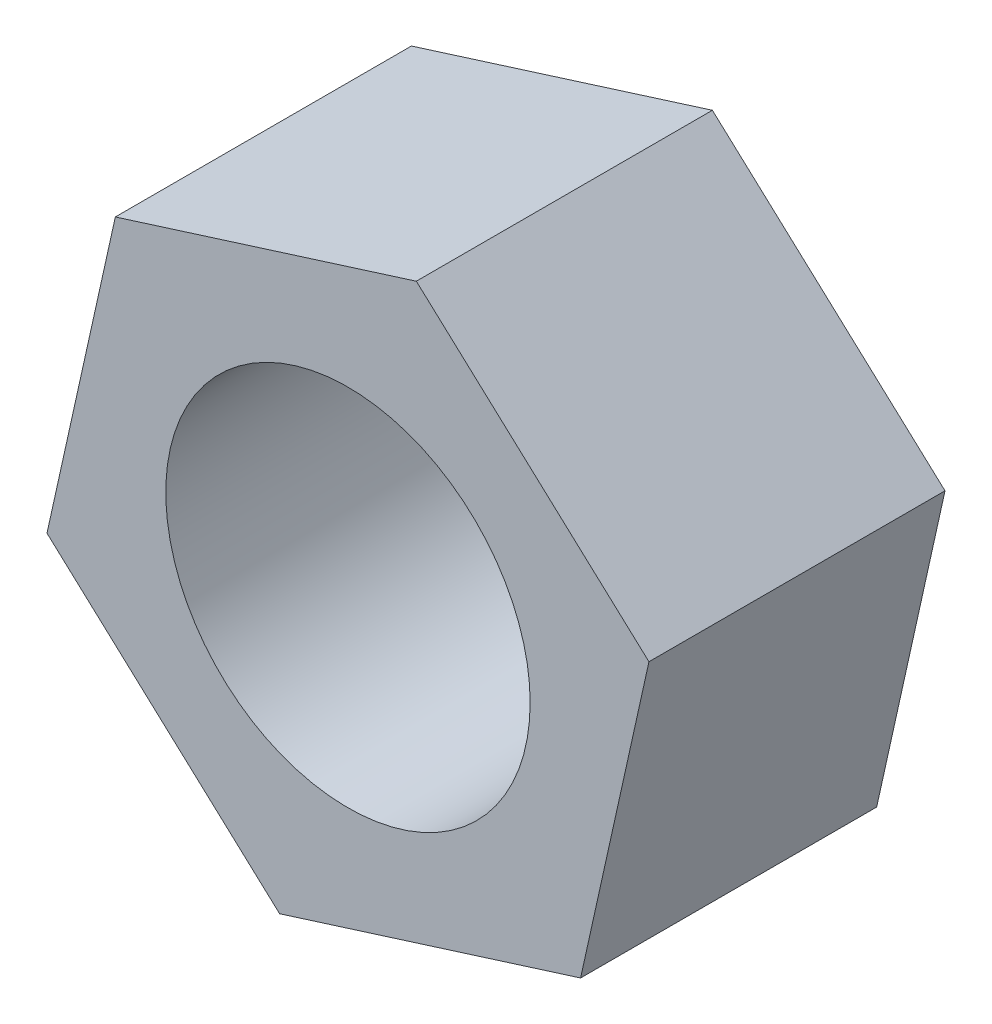
ISO-10303-21;
HEADER;
FILE_DESCRIPTION(('STEP AP214'),'2;1');
FILE_NAME('part.step','',(''),(''),'','','');
FILE_SCHEMA(('AUTOMOTIVE_DESIGN { 1 0 10303 214 1 1 1 1 }'));
ENDSEC;
DATA;
#1=APPLICATION_CONTEXT('core data for automotive mechanical design processes');
#2=APPLICATION_PROTOCOL_DEFINITION('international standard','automotive_design',2000,#1);
#3=PRODUCT_CONTEXT('',#1,'mechanical');
#4=PRODUCT('Part','Part','',(#3));
#5=PRODUCT_RELATED_PRODUCT_CATEGORY('part','',(#4));
#6=PRODUCT_DEFINITION_FORMATION('','',#4);
#7=PRODUCT_DEFINITION_CONTEXT('part definition',#1,'design');
#8=PRODUCT_DEFINITION('design','',#6,#7);
#9=PRODUCT_DEFINITION_SHAPE('','',#8);
#10=(LENGTH_UNIT() NAMED_UNIT(*) SI_UNIT(.MILLI.,.METRE.));
#11=(NAMED_UNIT(*) PLANE_ANGLE_UNIT() SI_UNIT($,.RADIAN.));
#12=(NAMED_UNIT(*) SI_UNIT($,.STERADIAN.) SOLID_ANGLE_UNIT());
#13=UNCERTAINTY_MEASURE_WITH_UNIT(LENGTH_MEASURE(1.E-05),#10,'distance_accuracy_value','');
#14=(GEOMETRIC_REPRESENTATION_CONTEXT(3) GLOBAL_UNCERTAINTY_ASSIGNED_CONTEXT((#13)) GLOBAL_UNIT_ASSIGNED_CONTEXT((#10,
#11,#12)) REPRESENTATION_CONTEXT('',''));
#15=CARTESIAN_POINT('',(0.,0.,0.));
#16=DIRECTION('',(0.,0.,1.));
#17=DIRECTION('',(1.,0.,0.));
#18=AXIS2_PLACEMENT_3D('',#15,#16,#17);
#19=CARTESIAN_POINT('',(-3.00154184685829,-13.5274072364795,13.));
#20=DIRECTION('',(-0.300531897660053,0.953771764359193,0.));
#21=DIRECTION('',(-0.953771764359193,-0.300531897660053,0.));
#22=AXIS2_PLACEMENT_3D('',#19,#20,#21);
#23=PLANE('',#22);
#24=DIRECTION('',(0.953771764359193,0.300531897660053,0.));
#25=VECTOR('',#24,1.);
#26=CARTESIAN_POINT('',(-3.00154184685829,-13.5274072364795,0.));
#27=LINE('',#26,#25);
#28=CARTESIAN_POINT('',(-3.00154184685829,-13.5274072364795,0.));
#29=VERTEX_POINT('',#28);
#30=CARTESIAN_POINT('',(10.2143073906996,-9.36311510814111,0.));
#31=VERTEX_POINT('',#30);
#32=EDGE_CURVE('E128',#29,#31,#27,.T.);
#33=ORIENTED_EDGE('',*,*,#32,.T.);
#34=DIRECTION('',(0.,0.,-1.));
#35=VECTOR('',#34,1.);
#36=CARTESIAN_POINT('',(10.2143073906996,-9.36311510814111,13.));
#37=LINE('',#36,#35);
#38=CARTESIAN_POINT('',(10.2143073906996,-9.36311510814111,13.));
#39=VERTEX_POINT('',#38);
#40=EDGE_CURVE('E11',#39,#31,#37,.T.);
#41=ORIENTED_EDGE('',*,*,#40,.F.);
#42=DIRECTION('',(0.953771764359193,0.300531897660053,0.));
#43=VECTOR('',#42,1.);
#44=CARTESIAN_POINT('',(-3.00154184685829,-13.5274072364795,13.));
#45=LINE('',#44,#43);
#46=CARTESIAN_POINT('',(-3.00154184685829,-13.5274072364795,13.));
#47=VERTEX_POINT('',#46);
#48=EDGE_CURVE('E145',#47,#39,#45,.T.);
#49=ORIENTED_EDGE('',*,*,#48,.F.);
#50=DIRECTION('',(0.,0.,-1.));
#51=VECTOR('',#50,1.);
#52=CARTESIAN_POINT('',(-3.00154184685829,-13.5274072364795,13.));
#53=LINE('',#52,#51);
#54=EDGE_CURVE('E124',#47,#29,#53,.T.);
#55=ORIENTED_EDGE('',*,*,#54,.T.);
#56=EDGE_LOOP('',(#33,#41,#49,#55));
#57=FACE_BOUND('',#56,.T.);
#58=ADVANCED_FACE('F39',(#57),#23,.F.);
#59=CARTESIAN_POINT('',(10.2143073906996,-9.36311510814111,13.));
#60=DIRECTION('',(-0.976256526177393,0.216617624158445,0.));
#61=DIRECTION('',(-0.216617624158445,-0.976256526177393,0.));
#62=AXIS2_PLACEMENT_3D('',#59,#60,#61);
#63=PLANE('',#62);
#64=DIRECTION('',(0.216617624158445,0.976256526177393,0.));
#65=VECTOR('',#64,1.);
#66=CARTESIAN_POINT('',(10.2143073906996,-9.36311510814111,0.));
#67=LINE('',#66,#65);
#68=CARTESIAN_POINT('',(13.2158492375579,4.16429212833841,0.));
#69=VERTEX_POINT('',#68);
#70=EDGE_CURVE('E132',#31,#69,#67,.T.);
#71=ORIENTED_EDGE('',*,*,#70,.T.);
#72=DIRECTION('',(0.,0.,-1.));
#73=VECTOR('',#72,1.);
#74=CARTESIAN_POINT('',(13.2158492375579,4.16429212833841,13.));
#75=LINE('',#74,#73);
#76=CARTESIAN_POINT('',(13.2158492375579,4.16429212833841,13.));
#77=VERTEX_POINT('',#76);
#78=EDGE_CURVE('E48',#77,#69,#75,.T.);
#79=ORIENTED_EDGE('',*,*,#78,.F.);
#80=DIRECTION('',(0.216617624158445,0.976256526177393,0.));
#81=VECTOR('',#80,1.);
#82=CARTESIAN_POINT('',(10.2143073906996,-9.36311510814111,13.));
#83=LINE('',#82,#81);
#84=EDGE_CURVE('E93',#39,#77,#83,.T.);
#85=ORIENTED_EDGE('',*,*,#84,.F.);
#86=ORIENTED_EDGE('',*,*,#40,.T.);
#87=EDGE_LOOP('',(#71,#79,#85,#86));
#88=FACE_BOUND('',#87,.T.);
#89=ADVANCED_FACE('F174',(#88),#63,.F.);
#90=CARTESIAN_POINT('',(13.2158492375579,4.16429212833841,13.));
#91=DIRECTION('',(-0.67572462851734,-0.737154140200747,0.));
#92=DIRECTION('',(0.737154140200747,-0.67572462851734,0.));
#93=AXIS2_PLACEMENT_3D('',#90,#91,#92);
#94=PLANE('',#93);
#95=DIRECTION('',(-0.737154140200747,0.67572462851734,0.));
#96=VECTOR('',#95,1.);
#97=CARTESIAN_POINT('',(13.2158492375579,4.16429212833841,0.));
#98=LINE('',#97,#96);
#99=CARTESIAN_POINT('',(3.0015418468583,13.5274072364795,0.));
#100=VERTEX_POINT('',#99);
#101=EDGE_CURVE('E136',#69,#100,#98,.T.);
#102=ORIENTED_EDGE('',*,*,#101,.T.);
#103=DIRECTION('',(0.,0.,-1.));
#104=VECTOR('',#103,1.);
#105=CARTESIAN_POINT('',(3.0015418468583,13.5274072364795,13.));
#106=LINE('',#105,#104);
#107=CARTESIAN_POINT('',(3.0015418468583,13.5274072364795,13.));
#108=VERTEX_POINT('',#107);
#109=EDGE_CURVE('E117',#108,#100,#106,.T.);
#110=ORIENTED_EDGE('',*,*,#109,.F.);
#111=DIRECTION('',(-0.737154140200747,0.67572462851734,0.));
#112=VECTOR('',#111,1.);
#113=CARTESIAN_POINT('',(13.2158492375579,4.16429212833841,13.));
#114=LINE('',#113,#112);
#115=EDGE_CURVE('E106',#77,#108,#114,.T.);
#116=ORIENTED_EDGE('',*,*,#115,.F.);
#117=ORIENTED_EDGE('',*,*,#78,.T.);
#118=EDGE_LOOP('',(#102,#110,#116,#117));
#119=FACE_BOUND('',#118,.T.);
#120=ADVANCED_FACE('F155',(#119),#94,.F.);
#121=CARTESIAN_POINT('',(3.0015418468583,13.5274072364795,13.));
#122=DIRECTION('',(0.300531897660053,-0.953771764359193,0.));
#123=DIRECTION('',(0.953771764359193,0.300531897660053,0.));
#124=AXIS2_PLACEMENT_3D('',#121,#122,#123);
#125=PLANE('',#124);
#126=DIRECTION('',(-0.953771764359193,-0.300531897660053,0.));
#127=VECTOR('',#126,1.);
#128=CARTESIAN_POINT('',(3.0015418468583,13.5274072364795,0.));
#129=LINE('',#128,#127);
#130=CARTESIAN_POINT('',(-10.2143073906996,9.36311510814111,0.));
#131=VERTEX_POINT('',#130);
#132=EDGE_CURVE('E115',#100,#131,#129,.T.);
#133=ORIENTED_EDGE('',*,*,#132,.T.);
#134=DIRECTION('',(0.,0.,-1.));
#135=VECTOR('',#134,1.);
#136=CARTESIAN_POINT('',(-10.2143073906996,9.36311510814111,13.));
#137=LINE('',#136,#135);
#138=CARTESIAN_POINT('',(-10.2143073906996,9.36311510814111,13.));
#139=VERTEX_POINT('',#138);
#140=EDGE_CURVE('E112',#139,#131,#137,.T.);
#141=ORIENTED_EDGE('',*,*,#140,.F.);
#142=DIRECTION('',(-0.953771764359193,-0.300531897660053,0.));
#143=VECTOR('',#142,1.);
#144=CARTESIAN_POINT('',(3.0015418468583,13.5274072364795,13.));
#145=LINE('',#144,#143);
#146=EDGE_CURVE('E100',#108,#139,#145,.T.);
#147=ORIENTED_EDGE('',*,*,#146,.F.);
#148=ORIENTED_EDGE('',*,*,#109,.T.);
#149=EDGE_LOOP('',(#133,#141,#147,#148));
#150=FACE_BOUND('',#149,.T.);
#151=ADVANCED_FACE('F113',(#150),#125,.F.);
#152=CARTESIAN_POINT('',(-10.2143073906996,9.36311510814111,13.));
#153=DIRECTION('',(0.976256526177393,-0.216617624158446,0.));
#154=DIRECTION('',(0.216617624158446,0.976256526177393,0.));
#155=AXIS2_PLACEMENT_3D('',#152,#153,#154);
#156=PLANE('',#155);
#157=DIRECTION('',(-0.216617624158446,-0.976256526177393,0.));
#158=VECTOR('',#157,1.);
#159=CARTESIAN_POINT('',(-10.2143073906996,9.36311510814111,0.));
#160=LINE('',#159,#158);
#161=CARTESIAN_POINT('',(-13.2158492375579,-4.16429212833841,0.));
#162=VERTEX_POINT('',#161);
#163=EDGE_CURVE('E79',#131,#162,#160,.T.);
#164=ORIENTED_EDGE('',*,*,#163,.T.);
#165=DIRECTION('',(0.,0.,-1.));
#166=VECTOR('',#165,1.);
#167=CARTESIAN_POINT('',(-13.2158492375579,-4.16429212833841,13.));
#168=LINE('',#167,#166);
#169=CARTESIAN_POINT('',(-13.2158492375579,-4.16429212833841,13.));
#170=VERTEX_POINT('',#169);
#171=EDGE_CURVE('E118',#170,#162,#168,.T.);
#172=ORIENTED_EDGE('',*,*,#171,.F.);
#173=DIRECTION('',(-0.216617624158446,-0.976256526177393,0.));
#174=VECTOR('',#173,1.);
#175=CARTESIAN_POINT('',(-10.2143073906996,9.36311510814111,13.));
#176=LINE('',#175,#174);
#177=EDGE_CURVE('E104',#139,#170,#176,.T.);
#178=ORIENTED_EDGE('',*,*,#177,.F.);
#179=ORIENTED_EDGE('',*,*,#140,.T.);
#180=EDGE_LOOP('',(#164,#172,#178,#179));
#181=FACE_BOUND('',#180,.T.);
#182=ADVANCED_FACE('F120',(#181),#156,.F.);
#183=CARTESIAN_POINT('',(-13.2158492375579,-4.16429212833841,13.));
#184=DIRECTION('',(0.67572462851734,0.737154140200747,0.));
#185=DIRECTION('',(-0.737154140200747,0.67572462851734,0.));
#186=AXIS2_PLACEMENT_3D('',#183,#184,#185);
#187=PLANE('',#186);
#188=DIRECTION('',(0.737154140200747,-0.67572462851734,0.));
#189=VECTOR('',#188,1.);
#190=CARTESIAN_POINT('',(-13.2158492375579,-4.16429212833841,0.));
#191=LINE('',#190,#189);
#192=EDGE_CURVE('E85',#162,#29,#191,.T.);
#193=ORIENTED_EDGE('',*,*,#192,.T.);
#194=ORIENTED_EDGE('',*,*,#54,.F.);
#195=DIRECTION('',(0.737154140200747,-0.67572462851734,0.));
#196=VECTOR('',#195,1.);
#197=CARTESIAN_POINT('',(-13.2158492375579,-4.16429212833841,13.));
#198=LINE('',#197,#196);
#199=EDGE_CURVE('E56',#170,#47,#198,.T.);
#200=ORIENTED_EDGE('',*,*,#199,.F.);
#201=ORIENTED_EDGE('',*,*,#171,.T.);
#202=EDGE_LOOP('',(#193,#194,#200,#201));
#203=FACE_BOUND('',#202,.T.);
#204=ADVANCED_FACE('F162',(#203),#187,.F.);
#205=CARTESIAN_POINT('',(0.,0.,13.));
#206=DIRECTION('',(0.,0.,1.));
#207=DIRECTION('',(1.,0.,0.));
#208=AXIS2_PLACEMENT_3D('',#205,#206,#207);
#209=PLANE('',#208);
#210=CARTESIAN_POINT('',(0.,0.,13.));
#211=DIRECTION('',(0.,0.,1.));
#212=DIRECTION('',(1.,0.,0.));
#213=AXIS2_PLACEMENT_3D('',#210,#211,#212);
#214=CIRCLE('',#213,8.);
#215=CARTESIAN_POINT('',(8.,0.,13.));
#216=VERTEX_POINT('',#215);
#217=EDGE_CURVE('E229',#216,#216,#214,.T.);
#218=ORIENTED_EDGE('',*,*,#217,.F.);
#219=EDGE_LOOP('',(#218));
#220=FACE_BOUND('',#219,.T.);
#221=ORIENTED_EDGE('',*,*,#48,.T.);
#222=ORIENTED_EDGE('',*,*,#84,.T.);
#223=ORIENTED_EDGE('',*,*,#115,.T.);
#224=ORIENTED_EDGE('',*,*,#146,.T.);
#225=ORIENTED_EDGE('',*,*,#177,.T.);
#226=ORIENTED_EDGE('',*,*,#199,.T.);
#227=EDGE_LOOP('',(#221,#222,#223,#224,#225,#226));
#228=FACE_BOUND('',#227,.T.);
#229=ADVANCED_FACE('F102',(#220,#228),#209,.T.);
#230=CARTESIAN_POINT('',(0.,0.,0.));
#231=DIRECTION('',(0.,0.,1.));
#232=DIRECTION('',(1.,0.,0.));
#233=AXIS2_PLACEMENT_3D('',#230,#231,#232);
#234=PLANE('',#233);
#235=CARTESIAN_POINT('',(0.,0.,0.));
#236=DIRECTION('',(0.,0.,1.));
#237=DIRECTION('',(1.,0.,0.));
#238=AXIS2_PLACEMENT_3D('',#235,#236,#237);
#239=CIRCLE('',#238,8.);
#240=CARTESIAN_POINT('',(8.,0.,0.));
#241=VERTEX_POINT('',#240);
#242=EDGE_CURVE('E133',#241,#241,#239,.T.);
#243=ORIENTED_EDGE('',*,*,#242,.T.);
#244=EDGE_LOOP('',(#243));
#245=FACE_BOUND('',#244,.T.);
#246=ORIENTED_EDGE('',*,*,#32,.F.);
#247=ORIENTED_EDGE('',*,*,#192,.F.);
#248=ORIENTED_EDGE('',*,*,#163,.F.);
#249=ORIENTED_EDGE('',*,*,#132,.F.);
#250=ORIENTED_EDGE('',*,*,#101,.F.);
#251=ORIENTED_EDGE('',*,*,#70,.F.);
#252=EDGE_LOOP('',(#246,#247,#248,#249,#250,#251));
#253=FACE_BOUND('',#252,.T.);
#254=ADVANCED_FACE('F158',(#245,#253),#234,.F.);
#255=CARTESIAN_POINT('',(0.,0.,0.));
#256=DIRECTION('',(0.,0.,1.));
#257=DIRECTION('',(1.,0.,0.));
#258=AXIS2_PLACEMENT_3D('',#255,#256,#257);
#259=CYLINDRICAL_SURFACE('',#258,8.);
#260=CARTESIAN_POINT('',(8.,0.,0.));
#261=CARTESIAN_POINT('',(8.,0.,0.135416666666666));
#262=CARTESIAN_POINT('',(8.,0.,0.270833333333333));
#263=CARTESIAN_POINT('',(8.,0.,0.541666666666667));
#264=CARTESIAN_POINT('',(8.,0.,0.677083333333333));
#265=CARTESIAN_POINT('',(8.,0.,0.947916666666667));
#266=CARTESIAN_POINT('',(8.,0.,1.08333333333333));
#267=CARTESIAN_POINT('',(8.,0.,1.35416666666667));
#268=CARTESIAN_POINT('',(8.,0.,1.48958333333333));
#269=CARTESIAN_POINT('',(8.,0.,1.76041666666667));
#270=CARTESIAN_POINT('',(8.,0.,1.89583333333333));
#271=CARTESIAN_POINT('',(8.,0.,2.16666666666667));
#272=CARTESIAN_POINT('',(8.,0.,2.30208333333333));
#273=CARTESIAN_POINT('',(8.,0.,2.57291666666667));
#274=CARTESIAN_POINT('',(8.,0.,2.70833333333333));
#275=CARTESIAN_POINT('',(8.,0.,2.97916666666667));
#276=CARTESIAN_POINT('',(8.,0.,3.11458333333333));
#277=CARTESIAN_POINT('',(8.,0.,3.38541666666667));
#278=CARTESIAN_POINT('',(8.,0.,3.52083333333333));
#279=CARTESIAN_POINT('',(8.,0.,3.79166666666667));
#280=CARTESIAN_POINT('',(8.,0.,3.92708333333333));
#281=CARTESIAN_POINT('',(8.,0.,4.19791666666667));
#282=CARTESIAN_POINT('',(8.,0.,4.33333333333333));
#283=CARTESIAN_POINT('',(8.,0.,4.60416666666667));
#284=CARTESIAN_POINT('',(8.,0.,4.73958333333333));
#285=CARTESIAN_POINT('',(8.,0.,5.01041666666667));
#286=CARTESIAN_POINT('',(8.,0.,5.14583333333333));
#287=CARTESIAN_POINT('',(8.,0.,5.41666666666667));
#288=CARTESIAN_POINT('',(8.,0.,5.55208333333333));
#289=CARTESIAN_POINT('',(8.,0.,5.82291666666667));
#290=CARTESIAN_POINT('',(8.,0.,5.95833333333333));
#291=CARTESIAN_POINT('',(8.,0.,6.22916666666667));
#292=CARTESIAN_POINT('',(8.,0.,6.36458333333333));
#293=CARTESIAN_POINT('',(8.,0.,6.63541666666667));
#294=CARTESIAN_POINT('',(8.,0.,6.77083333333333));
#295=CARTESIAN_POINT('',(8.,0.,7.04166666666667));
#296=CARTESIAN_POINT('',(8.,0.,7.17708333333333));
#297=CARTESIAN_POINT('',(8.,0.,7.44791666666667));
#298=CARTESIAN_POINT('',(8.,0.,7.58333333333333));
#299=CARTESIAN_POINT('',(8.,0.,7.85416666666667));
#300=CARTESIAN_POINT('',(8.,0.,7.98958333333333));
#301=CARTESIAN_POINT('',(8.,0.,8.26041666666667));
#302=CARTESIAN_POINT('',(8.,0.,8.39583333333333));
#303=CARTESIAN_POINT('',(8.,0.,8.66666666666667));
#304=CARTESIAN_POINT('',(8.,0.,8.80208333333333));
#305=CARTESIAN_POINT('',(8.,0.,9.07291666666667));
#306=CARTESIAN_POINT('',(8.,0.,9.20833333333333));
#307=CARTESIAN_POINT('',(8.,0.,9.47916666666667));
#308=CARTESIAN_POINT('',(8.,0.,9.61458333333333));
#309=CARTESIAN_POINT('',(8.,0.,9.88541666666667));
#310=CARTESIAN_POINT('',(8.,0.,10.0208333333333));
#311=CARTESIAN_POINT('',(8.,0.,10.2916666666667));
#312=CARTESIAN_POINT('',(8.,0.,10.4270833333333));
#313=CARTESIAN_POINT('',(8.,0.,10.6979166666667));
#314=CARTESIAN_POINT('',(8.,0.,10.8333333333333));
#315=CARTESIAN_POINT('',(8.,0.,11.1041666666667));
#316=CARTESIAN_POINT('',(8.,0.,11.2395833333333));
#317=CARTESIAN_POINT('',(8.,0.,11.5104166666667));
#318=CARTESIAN_POINT('',(8.,0.,11.6458333333333));
#319=CARTESIAN_POINT('',(8.,0.,11.9166666666667));
#320=CARTESIAN_POINT('',(8.,0.,12.0520833333333));
#321=CARTESIAN_POINT('',(8.,0.,12.3229166666667));
#322=CARTESIAN_POINT('',(8.,0.,12.4583333333333));
#323=CARTESIAN_POINT('',(8.,0.,12.7291666666667));
#324=CARTESIAN_POINT('',(8.,0.,12.8645833333333));
#325=CARTESIAN_POINT('',(8.,0.,13.));
#326=B_SPLINE_CURVE_WITH_KNOTS('',3,(#260,#261,#262,#263,#264,#265,#266,#267,#268,#269,#270,
#271,#272,#273,#274,#275,#276,#277,#278,#279,#280,#281,#282,#283,#284,#285,#286,#287,#288,#289,
#290,#291,#292,#293,#294,#295,#296,#297,#298,#299,#300,#301,#302,#303,#304,#305,#306,#307,#308,
#309,#310,#311,#312,#313,#314,#315,#316,#317,#318,#319,#320,#321,#322,#323,#324,#325),
.UNSPECIFIED.,.F.,.F.,(4,2,2,2,2,2,2,2,2,2,2,2,2,2,2,2,2,2,2,2,2,2,2,2,2,2,2,2,2,2,2,2,4),(0.,
0.40625,0.8125,1.21875,1.625,2.03125,2.4375,2.84375,3.25,3.65625,4.0625,4.46875,4.875,5.28125,
5.6875,6.09375,6.5,6.90625,7.3125,7.71875,8.125,8.53125,8.9375,9.34375,9.75,10.15625,10.5625,
10.96875,11.375,11.78125,12.1875,12.59375,13.),.UNSPECIFIED.);
#327=EDGE_CURVE('BSEAM211',#241,#216,#326,.T.);
#328=ORIENTED_EDGE('',*,*,#242,.F.);
#329=ORIENTED_EDGE('',*,*,#217,.T.);
#330=ORIENTED_EDGE('',*,*,#327,.T.);
#331=ORIENTED_EDGE('',*,*,#327,.F.);
#332=EDGE_LOOP('',(#328,#330,#329,#331));
#333=FACE_BOUND('',#332,.T.);
#334=ADVANCED_FACE('F211',(#333),#259,.F.);
#335=CLOSED_SHELL('',(#58,#89,#120,#151,#182,#204,#229,#254,#334));
#336=MANIFOLD_SOLID_BREP('B2',#335);
#337=ADVANCED_BREP_SHAPE_REPRESENTATION('',(#18,#336),#14);
#338=SHAPE_DEFINITION_REPRESENTATION(#9,#337);
ENDSEC;
END-ISO-10303-21;
